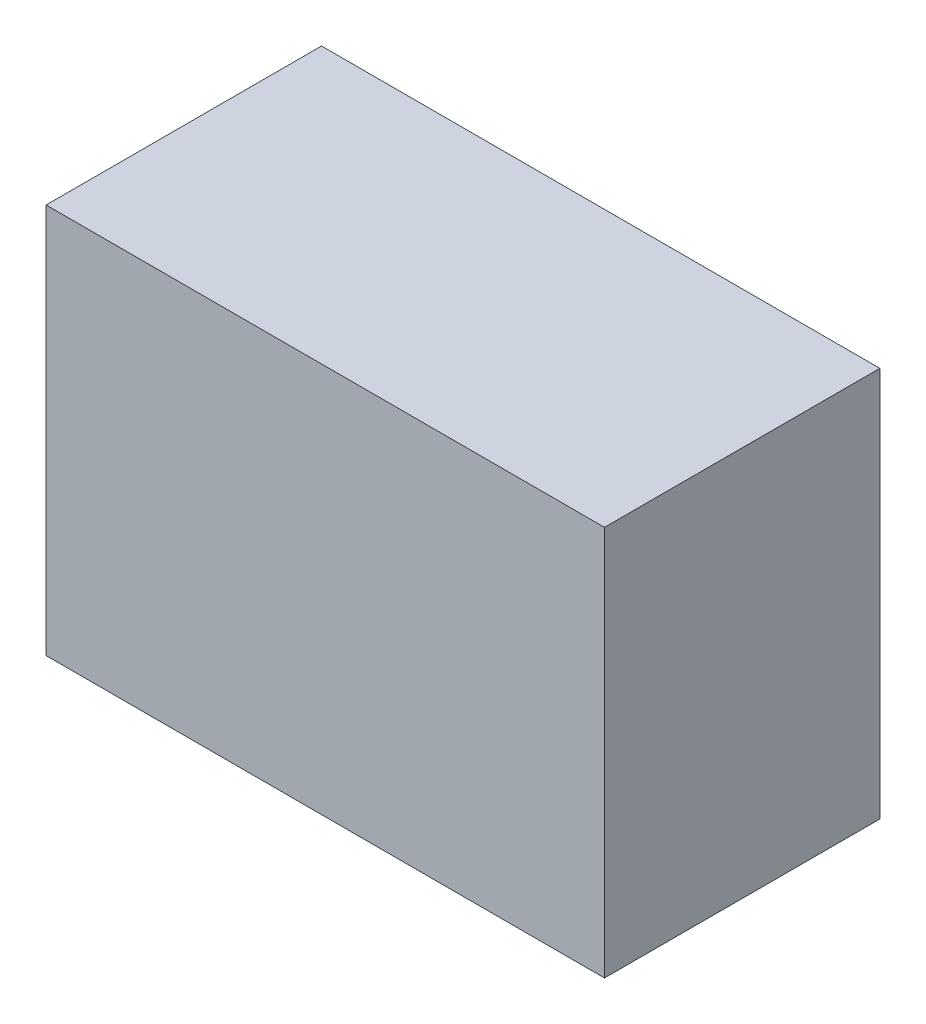
ISO-10303-21;
HEADER;
FILE_DESCRIPTION(('STEP AP214'),'2;1');
FILE_NAME('part.step','',(''),(''),'','','');
FILE_SCHEMA(('AUTOMOTIVE_DESIGN { 1 0 10303 214 1 1 1 1 }'));
ENDSEC;
DATA;
#1=APPLICATION_CONTEXT('core data for automotive mechanical design processes');
#2=APPLICATION_PROTOCOL_DEFINITION('international standard','automotive_design',2000,#1);
#3=PRODUCT_CONTEXT('',#1,'mechanical');
#4=PRODUCT('Part','Part','',(#3));
#5=PRODUCT_RELATED_PRODUCT_CATEGORY('part','',(#4));
#6=PRODUCT_DEFINITION_FORMATION('','',#4);
#7=PRODUCT_DEFINITION_CONTEXT('part definition',#1,'design');
#8=PRODUCT_DEFINITION('design','',#6,#7);
#9=PRODUCT_DEFINITION_SHAPE('','',#8);
#10=(LENGTH_UNIT() NAMED_UNIT(*) SI_UNIT(.MILLI.,.METRE.));
#11=(NAMED_UNIT(*) PLANE_ANGLE_UNIT() SI_UNIT($,.RADIAN.));
#12=(NAMED_UNIT(*) SI_UNIT($,.STERADIAN.) SOLID_ANGLE_UNIT());
#13=UNCERTAINTY_MEASURE_WITH_UNIT(LENGTH_MEASURE(1.E-05),#10,'distance_accuracy_value','');
#14=(GEOMETRIC_REPRESENTATION_CONTEXT(3) GLOBAL_UNCERTAINTY_ASSIGNED_CONTEXT((#13)) GLOBAL_UNIT_ASSIGNED_CONTEXT((#10,
#11,#12)) REPRESENTATION_CONTEXT('',''));
#15=CARTESIAN_POINT('',(0.,0.,0.));
#16=DIRECTION('',(0.,0.,1.));
#17=DIRECTION('',(1.,0.,0.));
#18=AXIS2_PLACEMENT_3D('',#15,#16,#17);
#19=CARTESIAN_POINT('',(5.14999986,-3.60000042,5.08));
#20=DIRECTION('',(0.,0.,-1.));
#21=DIRECTION('',(-1.,0.,0.));
#22=AXIS2_PLACEMENT_3D('',#19,#20,#21);
#23=PLANE('',#22);
#24=DIRECTION('',(1.,0.,0.));
#25=VECTOR('',#24,1.);
#26=CARTESIAN_POINT('',(5.14999986,3.60000042,5.08));
#27=LINE('',#26,#25);
#28=CARTESIAN_POINT('',(5.14999986,3.60000042,5.08));
#29=VERTEX_POINT('',#28);
#30=CARTESIAN_POINT('',(-5.14999986,3.60000042,5.08));
#31=VERTEX_POINT('',#30);
#32=EDGE_CURVE('E53',#29,#31,#27,.F.);
#33=ORIENTED_EDGE('',*,*,#32,.T.);
#34=DIRECTION('',(0.,1.,0.));
#35=VECTOR('',#34,1.);
#36=CARTESIAN_POINT('',(-5.14999986,3.60000042,5.08));
#37=LINE('',#36,#35);
#38=CARTESIAN_POINT('',(-5.14999986,-3.60000042,5.08));
#39=VERTEX_POINT('',#38);
#40=EDGE_CURVE('E55',#31,#39,#37,.F.);
#41=ORIENTED_EDGE('',*,*,#40,.T.);
#42=DIRECTION('',(1.,0.,0.));
#43=VECTOR('',#42,1.);
#44=CARTESIAN_POINT('',(-5.14999986,-3.60000042,5.08));
#45=LINE('',#44,#43);
#46=CARTESIAN_POINT('',(5.14999986,-3.60000042,5.08));
#47=VERTEX_POINT('',#46);
#48=EDGE_CURVE('E18',#39,#47,#45,.T.);
#49=ORIENTED_EDGE('',*,*,#48,.T.);
#50=DIRECTION('',(0.,1.,0.));
#51=VECTOR('',#50,1.);
#52=CARTESIAN_POINT('',(5.14999986,-3.60000042,5.08));
#53=LINE('',#52,#51);
#54=EDGE_CURVE('E78',#47,#29,#53,.T.);
#55=ORIENTED_EDGE('',*,*,#54,.T.);
#56=EDGE_LOOP('',(#33,#41,#49,#55));
#57=FACE_BOUND('',#56,.T.);
#58=ADVANCED_FACE('F15',(#57),#23,.F.);
#59=CARTESIAN_POINT('',(-5.14999986,-3.60000042,0.));
#60=DIRECTION('',(0.,1.,0.));
#61=DIRECTION('',(0.,0.,1.));
#62=AXIS2_PLACEMENT_3D('',#59,#60,#61);
#63=PLANE('',#62);
#64=DIRECTION('',(0.,0.,1.));
#65=VECTOR('',#64,1.);
#66=CARTESIAN_POINT('',(5.14999986,-3.60000042,0.));
#67=LINE('',#66,#65);
#68=CARTESIAN_POINT('',(5.14999986,-3.60000042,0.));
#69=VERTEX_POINT('',#68);
#70=EDGE_CURVE('E66',#69,#47,#67,.T.);
#71=ORIENTED_EDGE('',*,*,#70,.T.);
#72=ORIENTED_EDGE('',*,*,#48,.F.);
#73=DIRECTION('',(0.,0.,-1.));
#74=VECTOR('',#73,1.);
#75=CARTESIAN_POINT('',(-5.14999986,-3.60000042,0.));
#76=LINE('',#75,#74);
#77=CARTESIAN_POINT('',(-5.14999986,-3.60000042,0.));
#78=VERTEX_POINT('',#77);
#79=EDGE_CURVE('E61',#39,#78,#76,.T.);
#80=ORIENTED_EDGE('',*,*,#79,.T.);
#81=DIRECTION('',(-1.,0.,0.));
#82=VECTOR('',#81,1.);
#83=CARTESIAN_POINT('',(5.14999986,-3.60000042,0.));
#84=LINE('',#83,#82);
#85=EDGE_CURVE('E81',#69,#78,#84,.T.);
#86=ORIENTED_EDGE('',*,*,#85,.F.);
#87=EDGE_LOOP('',(#71,#72,#80,#86));
#88=FACE_BOUND('',#87,.T.);
#89=ADVANCED_FACE('F63',(#88),#63,.F.);
#90=CARTESIAN_POINT('',(-5.14999986,3.60000042,0.));
#91=DIRECTION('',(1.,0.,0.));
#92=DIRECTION('',(0.,0.,-1.));
#93=AXIS2_PLACEMENT_3D('',#90,#91,#92);
#94=PLANE('',#93);
#95=ORIENTED_EDGE('',*,*,#79,.F.);
#96=ORIENTED_EDGE('',*,*,#40,.F.);
#97=DIRECTION('',(0.,0.,-1.));
#98=VECTOR('',#97,1.);
#99=CARTESIAN_POINT('',(-5.14999986,3.60000042,0.));
#100=LINE('',#99,#98);
#101=CARTESIAN_POINT('',(-5.14999986,3.60000042,0.));
#102=VERTEX_POINT('',#101);
#103=EDGE_CURVE('E73',#31,#102,#100,.T.);
#104=ORIENTED_EDGE('',*,*,#103,.T.);
#105=DIRECTION('',(0.,1.,0.));
#106=VECTOR('',#105,1.);
#107=CARTESIAN_POINT('',(-5.14999986,-3.60000042,0.));
#108=LINE('',#107,#106);
#109=EDGE_CURVE('E70',#78,#102,#108,.T.);
#110=ORIENTED_EDGE('',*,*,#109,.F.);
#111=EDGE_LOOP('',(#95,#96,#104,#110));
#112=FACE_BOUND('',#111,.T.);
#113=ADVANCED_FACE('F68',(#112),#94,.F.);
#114=CARTESIAN_POINT('',(5.14999986,3.60000042,0.));
#115=DIRECTION('',(0.,-1.,0.));
#116=DIRECTION('',(0.,0.,-1.));
#117=AXIS2_PLACEMENT_3D('',#114,#115,#116);
#118=PLANE('',#117);
#119=ORIENTED_EDGE('',*,*,#103,.F.);
#120=ORIENTED_EDGE('',*,*,#32,.F.);
#121=DIRECTION('',(0.,0.,1.));
#122=VECTOR('',#121,1.);
#123=CARTESIAN_POINT('',(5.14999986,3.60000042,0.));
#124=LINE('',#123,#122);
#125=CARTESIAN_POINT('',(5.14999986,3.60000042,0.));
#126=VERTEX_POINT('',#125);
#127=EDGE_CURVE('E33',#29,#126,#124,.F.);
#128=ORIENTED_EDGE('',*,*,#127,.T.);
#129=DIRECTION('',(-1.,0.,0.));
#130=VECTOR('',#129,1.);
#131=CARTESIAN_POINT('',(5.14999986,3.60000042,0.));
#132=LINE('',#131,#130);
#133=EDGE_CURVE('E24',#102,#126,#132,.F.);
#134=ORIENTED_EDGE('',*,*,#133,.F.);
#135=EDGE_LOOP('',(#119,#120,#128,#134));
#136=FACE_BOUND('',#135,.T.);
#137=ADVANCED_FACE('F87',(#136),#118,.F.);
#138=CARTESIAN_POINT('',(5.14999986,-3.60000042,0.));
#139=DIRECTION('',(-1.,0.,0.));
#140=DIRECTION('',(0.,0.,1.));
#141=AXIS2_PLACEMENT_3D('',#138,#139,#140);
#142=PLANE('',#141);
#143=ORIENTED_EDGE('',*,*,#127,.F.);
#144=ORIENTED_EDGE('',*,*,#54,.F.);
#145=ORIENTED_EDGE('',*,*,#70,.F.);
#146=DIRECTION('',(0.,1.,0.));
#147=VECTOR('',#146,1.);
#148=CARTESIAN_POINT('',(5.14999986,-3.60000042,0.));
#149=LINE('',#148,#147);
#150=EDGE_CURVE('E10',#126,#69,#149,.F.);
#151=ORIENTED_EDGE('',*,*,#150,.F.);
#152=EDGE_LOOP('',(#143,#144,#145,#151));
#153=FACE_BOUND('',#152,.T.);
#154=ADVANCED_FACE('F89',(#153),#142,.F.);
#155=CARTESIAN_POINT('',(5.14999986,-3.60000042,0.));
#156=DIRECTION('',(0.,0.,-1.));
#157=DIRECTION('',(-1.,0.,0.));
#158=AXIS2_PLACEMENT_3D('',#155,#156,#157);
#159=PLANE('',#158);
#160=ORIENTED_EDGE('',*,*,#133,.T.);
#161=ORIENTED_EDGE('',*,*,#150,.T.);
#162=ORIENTED_EDGE('',*,*,#85,.T.);
#163=ORIENTED_EDGE('',*,*,#109,.T.);
#164=EDGE_LOOP('',(#160,#161,#162,#163));
#165=FACE_BOUND('',#164,.T.);
#166=ADVANCED_FACE('F86',(#165),#159,.T.);
#167=CLOSED_SHELL('',(#58,#89,#113,#137,#154,#166));
#168=MANIFOLD_SOLID_BREP('B1',#167);
#169=ADVANCED_BREP_SHAPE_REPRESENTATION('',(#18,#168),#14);
#170=SHAPE_DEFINITION_REPRESENTATION(#9,#169);
ENDSEC;
END-ISO-10303-21;
